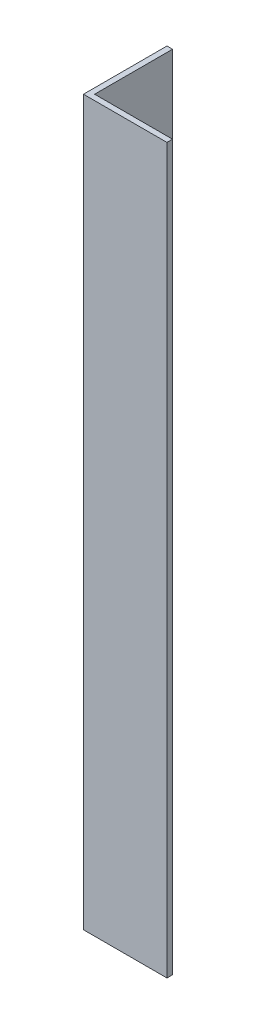
ISO-10303-21;
HEADER;
FILE_DESCRIPTION(('STEP AP214'),'2;1');
FILE_NAME('part.step','',(''),(''),'','','');
FILE_SCHEMA(('AUTOMOTIVE_DESIGN { 1 0 10303 214 1 1 1 1 }'));
ENDSEC;
DATA;
#1=APPLICATION_CONTEXT('core data for automotive mechanical design processes');
#2=APPLICATION_PROTOCOL_DEFINITION('international standard','automotive_design',2000,#1);
#3=PRODUCT_CONTEXT('',#1,'mechanical');
#4=PRODUCT('Part','Part','',(#3));
#5=PRODUCT_RELATED_PRODUCT_CATEGORY('part','',(#4));
#6=PRODUCT_DEFINITION_FORMATION('','',#4);
#7=PRODUCT_DEFINITION_CONTEXT('part definition',#1,'design');
#8=PRODUCT_DEFINITION('design','',#6,#7);
#9=PRODUCT_DEFINITION_SHAPE('','',#8);
#10=(LENGTH_UNIT() NAMED_UNIT(*) SI_UNIT(.MILLI.,.METRE.));
#11=(NAMED_UNIT(*) PLANE_ANGLE_UNIT() SI_UNIT($,.RADIAN.));
#12=(NAMED_UNIT(*) SI_UNIT($,.STERADIAN.) SOLID_ANGLE_UNIT());
#13=UNCERTAINTY_MEASURE_WITH_UNIT(LENGTH_MEASURE(1.E-05),#10,'distance_accuracy_value','');
#14=(GEOMETRIC_REPRESENTATION_CONTEXT(3) GLOBAL_UNCERTAINTY_ASSIGNED_CONTEXT((#13)) GLOBAL_UNIT_ASSIGNED_CONTEXT((#10,
#11,#12)) REPRESENTATION_CONTEXT('',''));
#15=CARTESIAN_POINT('',(0.,0.,0.));
#16=DIRECTION('',(0.,0.,1.));
#17=DIRECTION('',(1.,0.,0.));
#18=AXIS2_PLACEMENT_3D('',#15,#16,#17);
#19=CARTESIAN_POINT('',(0.,130.,0.));
#20=DIRECTION('',(0.,0.,1.));
#21=DIRECTION('',(1.,0.,0.));
#22=AXIS2_PLACEMENT_3D('',#19,#20,#21);
#23=PLANE('',#22);
#24=DIRECTION('',(0.,-1.,0.));
#25=VECTOR('',#24,1.);
#26=CARTESIAN_POINT('',(1.,130.,0.));
#27=LINE('',#26,#25);
#28=CARTESIAN_POINT('',(0.999999999999991,130.,0.));
#29=VERTEX_POINT('',#28);
#30=CARTESIAN_POINT('',(0.999999999999984,0.,0.));
#31=VERTEX_POINT('',#30);
#32=EDGE_CURVE('E49',#29,#31,#27,.T.);
#33=ORIENTED_EDGE('',*,*,#32,.F.);
#34=DIRECTION('',(-1.,0.,0.));
#35=VECTOR('',#34,1.);
#36=CARTESIAN_POINT('',(0.,130.,0.));
#37=LINE('',#36,#35);
#38=CARTESIAN_POINT('',(15.,130.,0.));
#39=VERTEX_POINT('',#38);
#40=EDGE_CURVE('E132',#39,#29,#37,.T.);
#41=ORIENTED_EDGE('',*,*,#40,.F.);
#42=DIRECTION('',(0.,-1.,0.));
#43=VECTOR('',#42,1.);
#44=CARTESIAN_POINT('',(15.,130.,0.));
#45=LINE('',#44,#43);
#46=CARTESIAN_POINT('',(15.,0.,0.));
#47=VERTEX_POINT('',#46);
#48=EDGE_CURVE('E134',#39,#47,#45,.T.);
#49=ORIENTED_EDGE('',*,*,#48,.T.);
#50=DIRECTION('',(-1.,0.,0.));
#51=VECTOR('',#50,1.);
#52=CARTESIAN_POINT('',(0.,0.,0.));
#53=LINE('',#52,#51);
#54=EDGE_CURVE('E102',#47,#31,#53,.T.);
#55=ORIENTED_EDGE('',*,*,#54,.T.);
#56=EDGE_LOOP('',(#33,#41,#49,#55));
#57=FACE_BOUND('',#56,.T.);
#58=ADVANCED_FACE('F34',(#57),#23,.F.);
#59=CARTESIAN_POINT('',(0.,130.,0.));
#60=DIRECTION('',(1.,0.,0.));
#61=DIRECTION('',(0.,0.,-1.));
#62=AXIS2_PLACEMENT_3D('',#59,#60,#61);
#63=PLANE('',#62);
#64=CARTESIAN_POINT('',(0.,15.,-7.));
#65=DIRECTION('',(-1.,0.,0.));
#66=DIRECTION('',(0.,0.,1.));
#67=AXIS2_PLACEMENT_3D('',#64,#65,#66);
#68=CIRCLE('',#67,1.24999999999999);
#69=CARTESIAN_POINT('',(0.,15.,-5.75000000000001));
#70=VERTEX_POINT('',#69);
#71=EDGE_CURVE('E234',#70,#70,#68,.T.);
#72=ORIENTED_EDGE('',*,*,#71,.F.);
#73=EDGE_LOOP('',(#72));
#74=FACE_BOUND('',#73,.T.);
#75=CARTESIAN_POINT('',(0.,75.,-7.));
#76=DIRECTION('',(-1.,0.,0.));
#77=DIRECTION('',(0.,0.,1.));
#78=AXIS2_PLACEMENT_3D('',#75,#76,#77);
#79=CIRCLE('',#78,1.24999999999999);
#80=CARTESIAN_POINT('',(0.,75.,-5.75000000000001));
#81=VERTEX_POINT('',#80);
#82=EDGE_CURVE('E237',#81,#81,#79,.T.);
#83=ORIENTED_EDGE('',*,*,#82,.F.);
#84=EDGE_LOOP('',(#83));
#85=FACE_BOUND('',#84,.T.);
#86=DIRECTION('',(0.,0.,1.));
#87=VECTOR('',#86,1.);
#88=CARTESIAN_POINT('',(0.,0.,0.));
#89=LINE('',#88,#87);
#90=CARTESIAN_POINT('',(0.,0.,-14.));
#91=VERTEX_POINT('',#90);
#92=CARTESIAN_POINT('',(0.,0.,1.));
#93=VERTEX_POINT('',#92);
#94=EDGE_CURVE('E128',#91,#93,#89,.T.);
#95=ORIENTED_EDGE('',*,*,#94,.T.);
#96=DIRECTION('',(0.,-1.,0.));
#97=VECTOR('',#96,1.);
#98=CARTESIAN_POINT('',(0.,130.,1.));
#99=LINE('',#98,#97);
#100=CARTESIAN_POINT('',(0.,130.,1.));
#101=VERTEX_POINT('',#100);
#102=EDGE_CURVE('E11',#101,#93,#99,.T.);
#103=ORIENTED_EDGE('',*,*,#102,.F.);
#104=DIRECTION('',(0.,0.,1.));
#105=VECTOR('',#104,1.);
#106=CARTESIAN_POINT('',(0.,130.,0.));
#107=LINE('',#106,#105);
#108=CARTESIAN_POINT('',(0.,130.,-14.));
#109=VERTEX_POINT('',#108);
#110=EDGE_CURVE('E97',#109,#101,#107,.T.);
#111=ORIENTED_EDGE('',*,*,#110,.F.);
#112=DIRECTION('',(0.,1.,0.));
#113=VECTOR('',#112,1.);
#114=CARTESIAN_POINT('',(0.,130.,-14.));
#115=LINE('',#114,#113);
#116=EDGE_CURVE('E101',#91,#109,#115,.T.);
#117=ORIENTED_EDGE('',*,*,#116,.F.);
#118=EDGE_LOOP('',(#95,#103,#111,#117));
#119=FACE_BOUND('',#118,.T.);
#120=ADVANCED_FACE('F36',(#74,#85,#119),#63,.F.);
#121=CARTESIAN_POINT('',(0.,130.,1.));
#122=DIRECTION('',(0.,0.,-1.));
#123=DIRECTION('',(-1.,0.,0.));
#124=AXIS2_PLACEMENT_3D('',#121,#122,#123);
#125=PLANE('',#124);
#126=DIRECTION('',(1.,0.,0.));
#127=VECTOR('',#126,1.);
#128=CARTESIAN_POINT('',(0.,0.,1.));
#129=LINE('',#128,#127);
#130=CARTESIAN_POINT('',(15.,0.,1.));
#131=VERTEX_POINT('',#130);
#132=EDGE_CURVE('E136',#93,#131,#129,.T.);
#133=ORIENTED_EDGE('',*,*,#132,.T.);
#134=DIRECTION('',(0.,-1.,0.));
#135=VECTOR('',#134,1.);
#136=CARTESIAN_POINT('',(15.,130.,1.));
#137=LINE('',#136,#135);
#138=CARTESIAN_POINT('',(15.,130.,1.));
#139=VERTEX_POINT('',#138);
#140=EDGE_CURVE('E42',#139,#131,#137,.T.);
#141=ORIENTED_EDGE('',*,*,#140,.F.);
#142=DIRECTION('',(1.,0.,0.));
#143=VECTOR('',#142,1.);
#144=CARTESIAN_POINT('',(0.,130.,1.));
#145=LINE('',#144,#143);
#146=EDGE_CURVE('E79',#101,#139,#145,.T.);
#147=ORIENTED_EDGE('',*,*,#146,.F.);
#148=ORIENTED_EDGE('',*,*,#102,.T.);
#149=EDGE_LOOP('',(#133,#141,#147,#148));
#150=FACE_BOUND('',#149,.T.);
#151=ADVANCED_FACE('F165',(#150),#125,.F.);
#152=CARTESIAN_POINT('',(15.,130.,0.));
#153=DIRECTION('',(-1.,0.,0.));
#154=DIRECTION('',(0.,0.,1.));
#155=AXIS2_PLACEMENT_3D('',#152,#153,#154);
#156=PLANE('',#155);
#157=DIRECTION('',(0.,0.,-1.));
#158=VECTOR('',#157,1.);
#159=CARTESIAN_POINT('',(15.,0.,0.));
#160=LINE('',#159,#158);
#161=EDGE_CURVE('E74',#131,#47,#160,.T.);
#162=ORIENTED_EDGE('',*,*,#161,.T.);
#163=ORIENTED_EDGE('',*,*,#48,.F.);
#164=DIRECTION('',(0.,0.,-1.));
#165=VECTOR('',#164,1.);
#166=CARTESIAN_POINT('',(15.,130.,0.));
#167=LINE('',#166,#165);
#168=EDGE_CURVE('E57',#139,#39,#167,.T.);
#169=ORIENTED_EDGE('',*,*,#168,.F.);
#170=ORIENTED_EDGE('',*,*,#140,.T.);
#171=EDGE_LOOP('',(#162,#163,#169,#170));
#172=FACE_BOUND('',#171,.T.);
#173=ADVANCED_FACE('F140',(#172),#156,.F.);
#174=CARTESIAN_POINT('',(0.,130.,0.));
#175=DIRECTION('',(0.,1.,0.));
#176=DIRECTION('',(0.,0.,1.));
#177=AXIS2_PLACEMENT_3D('',#174,#175,#176);
#178=PLANE('',#177);
#179=ORIENTED_EDGE('',*,*,#110,.T.);
#180=ORIENTED_EDGE('',*,*,#146,.T.);
#181=ORIENTED_EDGE('',*,*,#168,.T.);
#182=ORIENTED_EDGE('',*,*,#40,.T.);
#183=DIRECTION('',(0.,0.,1.));
#184=VECTOR('',#183,1.);
#185=CARTESIAN_POINT('',(1.,130.,-14.));
#186=LINE('',#185,#184);
#187=CARTESIAN_POINT('',(1.,130.,-14.));
#188=VERTEX_POINT('',#187);
#189=EDGE_CURVE('E108',#188,#29,#186,.T.);
#190=ORIENTED_EDGE('',*,*,#189,.F.);
#191=DIRECTION('',(1.,0.,0.));
#192=VECTOR('',#191,1.);
#193=CARTESIAN_POINT('',(0.,130.,-14.));
#194=LINE('',#193,#192);
#195=EDGE_CURVE('E105',#109,#188,#194,.T.);
#196=ORIENTED_EDGE('',*,*,#195,.F.);
#197=EDGE_LOOP('',(#179,#180,#181,#182,#190,#196));
#198=FACE_BOUND('',#197,.T.);
#199=ADVANCED_FACE('F106',(#198),#178,.T.);
#200=CARTESIAN_POINT('',(0.,0.,0.));
#201=DIRECTION('',(0.,1.,0.));
#202=DIRECTION('',(0.,0.,1.));
#203=AXIS2_PLACEMENT_3D('',#200,#201,#202);
#204=PLANE('',#203);
#205=ORIENTED_EDGE('',*,*,#94,.F.);
#206=DIRECTION('',(-1.,0.,0.));
#207=VECTOR('',#206,1.);
#208=CARTESIAN_POINT('',(0.,0.,-14.));
#209=LINE('',#208,#207);
#210=CARTESIAN_POINT('',(0.999999999999984,0.,-14.));
#211=VERTEX_POINT('',#210);
#212=EDGE_CURVE('E116',#211,#91,#209,.T.);
#213=ORIENTED_EDGE('',*,*,#212,.F.);
#214=DIRECTION('',(0.,0.,1.));
#215=VECTOR('',#214,1.);
#216=CARTESIAN_POINT('',(0.999999999999984,0.,-14.));
#217=LINE('',#216,#215);
#218=EDGE_CURVE('E124',#211,#31,#217,.T.);
#219=ORIENTED_EDGE('',*,*,#218,.T.);
#220=ORIENTED_EDGE('',*,*,#54,.F.);
#221=ORIENTED_EDGE('',*,*,#161,.F.);
#222=ORIENTED_EDGE('',*,*,#132,.F.);
#223=EDGE_LOOP('',(#205,#213,#219,#220,#221,#222));
#224=FACE_BOUND('',#223,.T.);
#225=ADVANCED_FACE('F143',(#224),#204,.F.);
#226=CARTESIAN_POINT('',(1.,130.,-14.));
#227=DIRECTION('',(-1.,0.,0.));
#228=DIRECTION('',(0.,-1.,0.));
#229=AXIS2_PLACEMENT_3D('',#226,#227,#228);
#230=PLANE('',#229);
#231=CARTESIAN_POINT('',(0.999999999999986,15.,-7.));
#232=DIRECTION('',(-1.,0.,0.));
#233=DIRECTION('',(0.,-1.,0.));
#234=AXIS2_PLACEMENT_3D('',#231,#232,#233);
#235=CIRCLE('',#234,1.24999999999999);
#236=CARTESIAN_POINT('',(0.999999999999985,13.75,-7.));
#237=VERTEX_POINT('',#236);
#238=EDGE_CURVE('E236',#237,#237,#235,.T.);
#239=ORIENTED_EDGE('',*,*,#238,.T.);
#240=EDGE_LOOP('',(#239));
#241=FACE_BOUND('',#240,.T.);
#242=CARTESIAN_POINT('',(0.999999999999993,75.,-7.));
#243=DIRECTION('',(-1.,0.,0.));
#244=DIRECTION('',(0.,-1.,0.));
#245=AXIS2_PLACEMENT_3D('',#242,#243,#244);
#246=CIRCLE('',#245,1.24999999999999);
#247=CARTESIAN_POINT('',(0.999999999999993,73.75,-7.));
#248=VERTEX_POINT('',#247);
#249=EDGE_CURVE('E118',#248,#248,#246,.T.);
#250=ORIENTED_EDGE('',*,*,#249,.T.);
#251=EDGE_LOOP('',(#250));
#252=FACE_BOUND('',#251,.T.);
#253=ORIENTED_EDGE('',*,*,#32,.T.);
#254=ORIENTED_EDGE('',*,*,#218,.F.);
#255=DIRECTION('',(0.,-1.,0.));
#256=VECTOR('',#255,1.);
#257=CARTESIAN_POINT('',(1.,130.,-14.));
#258=LINE('',#257,#256);
#259=EDGE_CURVE('E111',#188,#211,#258,.T.);
#260=ORIENTED_EDGE('',*,*,#259,.F.);
#261=ORIENTED_EDGE('',*,*,#189,.T.);
#262=EDGE_LOOP('',(#253,#254,#260,#261));
#263=FACE_BOUND('',#262,.T.);
#264=ADVANCED_FACE('F146',(#241,#252,#263),#230,.F.);
#265=CARTESIAN_POINT('',(0.,0.,-14.));
#266=DIRECTION('',(0.,0.,1.));
#267=DIRECTION('',(1.,0.,0.));
#268=AXIS2_PLACEMENT_3D('',#265,#266,#267);
#269=PLANE('',#268);
#270=ORIENTED_EDGE('',*,*,#116,.T.);
#271=ORIENTED_EDGE('',*,*,#195,.T.);
#272=ORIENTED_EDGE('',*,*,#259,.T.);
#273=ORIENTED_EDGE('',*,*,#212,.T.);
#274=EDGE_LOOP('',(#270,#271,#272,#273));
#275=FACE_BOUND('',#274,.T.);
#276=ADVANCED_FACE('F114',(#275),#269,.F.);
#277=CARTESIAN_POINT('',(0.,75.,-7.));
#278=DIRECTION('',(-1.,0.,0.));
#279=DIRECTION('',(0.,0.,1.));
#280=AXIS2_PLACEMENT_3D('',#277,#278,#279);
#281=CYLINDRICAL_SURFACE('',#280,1.24999999999999);
#282=ORIENTED_EDGE('',*,*,#82,.T.);
#283=EDGE_LOOP('',(#282));
#284=FACE_BOUND('',#283,.T.);
#285=ORIENTED_EDGE('',*,*,#249,.F.);
#286=EDGE_LOOP('',(#285));
#287=FACE_BOUND('',#286,.T.);
#288=ADVANCED_FACE('F154',(#284,#287),#281,.F.);
#289=CARTESIAN_POINT('',(0.,15.,-7.));
#290=DIRECTION('',(-1.,0.,0.));
#291=DIRECTION('',(0.,0.,1.));
#292=AXIS2_PLACEMENT_3D('',#289,#290,#291);
#293=CYLINDRICAL_SURFACE('',#292,1.24999999999999);
#294=ORIENTED_EDGE('',*,*,#71,.T.);
#295=EDGE_LOOP('',(#294));
#296=FACE_BOUND('',#295,.T.);
#297=ORIENTED_EDGE('',*,*,#238,.F.);
#298=EDGE_LOOP('',(#297));
#299=FACE_BOUND('',#298,.T.);
#300=ADVANCED_FACE('F214',(#296,#299),#293,.F.);
#301=CLOSED_SHELL('',(#58,#120,#151,#173,#199,#225,#264,#276,#288,#300));
#302=MANIFOLD_SOLID_BREP('B2',#301);
#303=ADVANCED_BREP_SHAPE_REPRESENTATION('',(#18,#302),#14);
#304=SHAPE_DEFINITION_REPRESENTATION(#9,#303);
ENDSEC;
END-ISO-10303-21;
